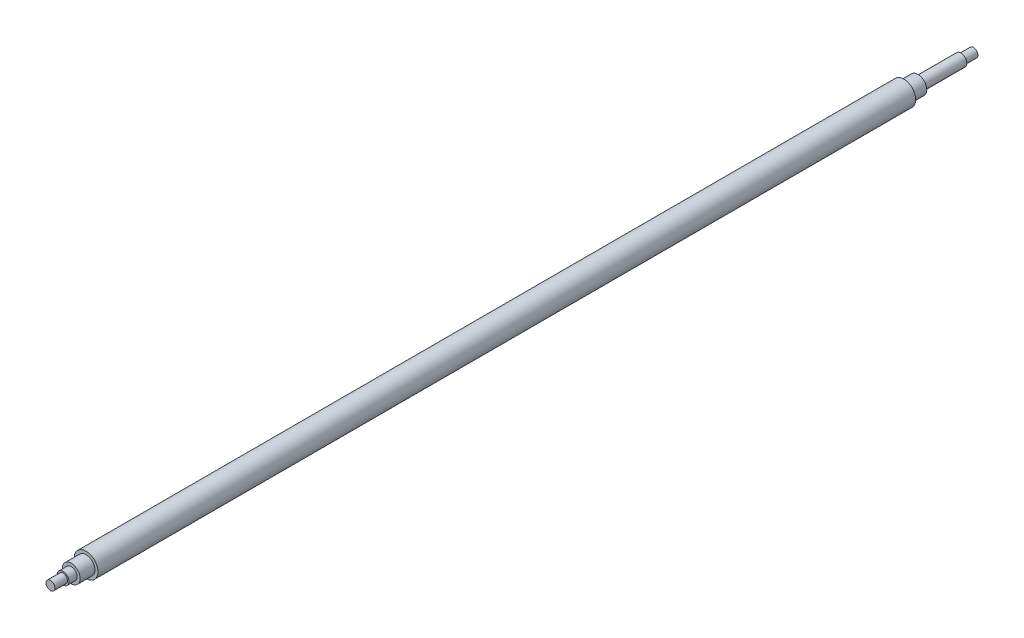
ISO-10303-21;
HEADER;
FILE_DESCRIPTION(('STEP AP214'),'2;1');
FILE_NAME('part.step','',(''),(''),'','','');
FILE_SCHEMA(('AUTOMOTIVE_DESIGN { 1 0 10303 214 1 1 1 1 }'));
ENDSEC;
DATA;
#1=APPLICATION_CONTEXT('core data for automotive mechanical design processes');
#2=APPLICATION_PROTOCOL_DEFINITION('international standard','automotive_design',2000,#1);
#3=PRODUCT_CONTEXT('',#1,'mechanical');
#4=PRODUCT('Part','Part','',(#3));
#5=PRODUCT_RELATED_PRODUCT_CATEGORY('part','',(#4));
#6=PRODUCT_DEFINITION_FORMATION('','',#4);
#7=PRODUCT_DEFINITION_CONTEXT('part definition',#1,'design');
#8=PRODUCT_DEFINITION('design','',#6,#7);
#9=PRODUCT_DEFINITION_SHAPE('','',#8);
#10=(LENGTH_UNIT() NAMED_UNIT(*) SI_UNIT(.MILLI.,.METRE.));
#11=(NAMED_UNIT(*) PLANE_ANGLE_UNIT() SI_UNIT($,.RADIAN.));
#12=(NAMED_UNIT(*) SI_UNIT($,.STERADIAN.) SOLID_ANGLE_UNIT());
#13=UNCERTAINTY_MEASURE_WITH_UNIT(LENGTH_MEASURE(1.E-05),#10,'distance_accuracy_value','');
#14=(GEOMETRIC_REPRESENTATION_CONTEXT(3) GLOBAL_UNCERTAINTY_ASSIGNED_CONTEXT((#13)) GLOBAL_UNIT_ASSIGNED_CONTEXT((#10,
#11,#12)) REPRESENTATION_CONTEXT('',''));
#15=CARTESIAN_POINT('',(0.,0.,0.));
#16=DIRECTION('',(0.,0.,1.));
#17=DIRECTION('',(1.,0.,0.));
#18=AXIS2_PLACEMENT_3D('',#15,#16,#17);
#19=CARTESIAN_POINT('',(0.,0.,-622.));
#20=DIRECTION('',(0.,0.,1.));
#21=DIRECTION('',(1.,0.,0.));
#22=AXIS2_PLACEMENT_3D('',#19,#20,#21);
#23=PLANE('',#22);
#24=CARTESIAN_POINT('',(0.,0.,-622.));
#25=DIRECTION('',(0.,0.,1.));
#26=DIRECTION('',(1.,0.,0.));
#27=AXIS2_PLACEMENT_3D('',#24,#25,#26);
#28=CIRCLE('',#27,3.);
#29=CARTESIAN_POINT('',(3.,0.,-622.));
#30=VERTEX_POINT('',#29);
#31=EDGE_CURVE('E76',#30,#30,#28,.T.);
#32=ORIENTED_EDGE('',*,*,#31,.F.);
#33=EDGE_LOOP('',(#32));
#34=FACE_BOUND('',#33,.T.);
#35=ADVANCED_FACE('F30',(#34),#23,.F.);
#36=CARTESIAN_POINT('',(0.,0.,0.));
#37=DIRECTION('',(0.,0.,-1.));
#38=DIRECTION('',(-1.,0.,0.));
#39=AXIS2_PLACEMENT_3D('',#36,#37,#38);
#40=PLANE('',#39);
#41=CARTESIAN_POINT('',(0.,0.,0.));
#42=DIRECTION('',(0.,0.,1.));
#43=DIRECTION('',(1.,0.,0.));
#44=AXIS2_PLACEMENT_3D('',#41,#42,#43);
#45=CIRCLE('',#44,3.);
#46=CARTESIAN_POINT('',(3.,0.,0.));
#47=VERTEX_POINT('',#46);
#48=EDGE_CURVE('E10',#47,#47,#45,.T.);
#49=ORIENTED_EDGE('',*,*,#48,.T.);
#50=EDGE_LOOP('',(#49));
#51=FACE_BOUND('',#50,.T.);
#52=ADVANCED_FACE('F83',(#51),#40,.F.);
#53=CARTESIAN_POINT('',(0.,0.,0.));
#54=DIRECTION('',(0.,0.,1.));
#55=DIRECTION('',(1.,0.,0.));
#56=AXIS2_PLACEMENT_3D('',#53,#54,#55);
#57=CYLINDRICAL_SURFACE('',#56,3.);
#58=ORIENTED_EDGE('',*,*,#48,.F.);
#59=EDGE_LOOP('',(#58));
#60=FACE_BOUND('',#59,.T.);
#61=CARTESIAN_POINT('',(0.,0.,-8.5));
#62=DIRECTION('',(0.,0.,1.));
#63=DIRECTION('',(1.,0.,0.));
#64=AXIS2_PLACEMENT_3D('',#61,#62,#63);
#65=CIRCLE('',#64,3.);
#66=CARTESIAN_POINT('',(3.,0.,-8.5));
#67=VERTEX_POINT('',#66);
#68=EDGE_CURVE('E36',#67,#67,#65,.T.);
#69=ORIENTED_EDGE('',*,*,#68,.T.);
#70=EDGE_LOOP('',(#69));
#71=FACE_BOUND('',#70,.T.);
#72=ADVANCED_FACE('F87',(#60,#71),#57,.T.);
#73=CARTESIAN_POINT('',(0.,3.,-8.5));
#74=DIRECTION('',(0.,0.,-1.));
#75=DIRECTION('',(-1.,0.,0.));
#76=AXIS2_PLACEMENT_3D('',#73,#74,#75);
#77=PLANE('',#76);
#78=ORIENTED_EDGE('',*,*,#68,.F.);
#79=EDGE_LOOP('',(#78));
#80=FACE_BOUND('',#79,.T.);
#81=CARTESIAN_POINT('',(0.,0.,-8.5));
#82=DIRECTION('',(0.,0.,1.));
#83=DIRECTION('',(1.,0.,0.));
#84=AXIS2_PLACEMENT_3D('',#81,#82,#83);
#85=CIRCLE('',#84,4.);
#86=CARTESIAN_POINT('',(4.,0.,-8.5));
#87=VERTEX_POINT('',#86);
#88=EDGE_CURVE('E40',#87,#87,#85,.T.);
#89=ORIENTED_EDGE('',*,*,#88,.T.);
#90=EDGE_LOOP('',(#89));
#91=FACE_BOUND('',#90,.T.);
#92=ADVANCED_FACE('F91',(#80,#91),#77,.F.);
#93=CARTESIAN_POINT('',(0.,0.,0.));
#94=DIRECTION('',(0.,0.,1.));
#95=DIRECTION('',(1.,0.,0.));
#96=AXIS2_PLACEMENT_3D('',#93,#94,#95);
#97=CYLINDRICAL_SURFACE('',#96,4.);
#98=ORIENTED_EDGE('',*,*,#88,.F.);
#99=EDGE_LOOP('',(#98));
#100=FACE_BOUND('',#99,.T.);
#101=CARTESIAN_POINT('',(0.,0.,-14.));
#102=DIRECTION('',(0.,0.,1.));
#103=DIRECTION('',(1.,0.,0.));
#104=AXIS2_PLACEMENT_3D('',#101,#102,#103);
#105=CIRCLE('',#104,4.);
#106=CARTESIAN_POINT('',(4.,0.,-14.));
#107=VERTEX_POINT('',#106);
#108=EDGE_CURVE('E44',#107,#107,#105,.T.);
#109=ORIENTED_EDGE('',*,*,#108,.T.);
#110=EDGE_LOOP('',(#109));
#111=FACE_BOUND('',#110,.T.);
#112=ADVANCED_FACE('F97',(#100,#111),#97,.T.);
#113=CARTESIAN_POINT('',(0.,4.,-14.));
#114=DIRECTION('',(0.,0.,-1.));
#115=DIRECTION('',(-1.,0.,0.));
#116=AXIS2_PLACEMENT_3D('',#113,#114,#115);
#117=PLANE('',#116);
#118=ORIENTED_EDGE('',*,*,#108,.F.);
#119=EDGE_LOOP('',(#118));
#120=FACE_BOUND('',#119,.T.);
#121=CARTESIAN_POINT('',(0.,0.,-14.));
#122=DIRECTION('',(0.,0.,1.));
#123=DIRECTION('',(1.,0.,0.));
#124=AXIS2_PLACEMENT_3D('',#121,#122,#123);
#125=CIRCLE('',#124,6.);
#126=CARTESIAN_POINT('',(6.,0.,-14.));
#127=VERTEX_POINT('',#126);
#128=EDGE_CURVE('E49',#127,#127,#125,.T.);
#129=ORIENTED_EDGE('',*,*,#128,.T.);
#130=EDGE_LOOP('',(#129));
#131=FACE_BOUND('',#130,.T.);
#132=ADVANCED_FACE('F101',(#120,#131),#117,.F.);
#133=CARTESIAN_POINT('',(0.,0.,0.));
#134=DIRECTION('',(0.,0.,1.));
#135=DIRECTION('',(1.,0.,0.));
#136=AXIS2_PLACEMENT_3D('',#133,#134,#135);
#137=CYLINDRICAL_SURFACE('',#136,6.);
#138=ORIENTED_EDGE('',*,*,#128,.F.);
#139=EDGE_LOOP('',(#138));
#140=FACE_BOUND('',#139,.T.);
#141=CARTESIAN_POINT('',(0.,0.,-24.));
#142=DIRECTION('',(0.,0.,1.));
#143=DIRECTION('',(1.,0.,0.));
#144=AXIS2_PLACEMENT_3D('',#141,#142,#143);
#145=CIRCLE('',#144,6.);
#146=CARTESIAN_POINT('',(6.,0.,-24.));
#147=VERTEX_POINT('',#146);
#148=EDGE_CURVE('E52',#147,#147,#145,.T.);
#149=ORIENTED_EDGE('',*,*,#148,.T.);
#150=EDGE_LOOP('',(#149));
#151=FACE_BOUND('',#150,.T.);
#152=ADVANCED_FACE('F105',(#140,#151),#137,.T.);
#153=CARTESIAN_POINT('',(0.,6.,-24.));
#154=DIRECTION('',(0.,0.,-1.));
#155=DIRECTION('',(-1.,0.,0.));
#156=AXIS2_PLACEMENT_3D('',#153,#154,#155);
#157=PLANE('',#156);
#158=ORIENTED_EDGE('',*,*,#148,.F.);
#159=EDGE_LOOP('',(#158));
#160=FACE_BOUND('',#159,.T.);
#161=CARTESIAN_POINT('',(0.,0.,-24.));
#162=DIRECTION('',(0.,0.,1.));
#163=DIRECTION('',(1.,0.,0.));
#164=AXIS2_PLACEMENT_3D('',#161,#162,#163);
#165=CIRCLE('',#164,8.);
#166=CARTESIAN_POINT('',(8.,0.,-24.));
#167=VERTEX_POINT('',#166);
#168=EDGE_CURVE('E55',#167,#167,#165,.T.);
#169=ORIENTED_EDGE('',*,*,#168,.T.);
#170=EDGE_LOOP('',(#169));
#171=FACE_BOUND('',#170,.T.);
#172=ADVANCED_FACE('F109',(#160,#171),#157,.F.);
#173=CARTESIAN_POINT('',(0.,0.,0.));
#174=DIRECTION('',(0.,0.,1.));
#175=DIRECTION('',(1.,0.,0.));
#176=AXIS2_PLACEMENT_3D('',#173,#174,#175);
#177=CYLINDRICAL_SURFACE('',#176,8.);
#178=ORIENTED_EDGE('',*,*,#168,.F.);
#179=EDGE_LOOP('',(#178));
#180=FACE_BOUND('',#179,.T.);
#181=CARTESIAN_POINT('',(0.,0.,-575.));
#182=DIRECTION('',(0.,0.,1.));
#183=DIRECTION('',(1.,0.,0.));
#184=AXIS2_PLACEMENT_3D('',#181,#182,#183);
#185=CIRCLE('',#184,8.);
#186=CARTESIAN_POINT('',(8.,0.,-575.));
#187=VERTEX_POINT('',#186);
#188=EDGE_CURVE('E58',#187,#187,#185,.T.);
#189=ORIENTED_EDGE('',*,*,#188,.T.);
#190=EDGE_LOOP('',(#189));
#191=FACE_BOUND('',#190,.T.);
#192=ADVANCED_FACE('F113',(#180,#191),#177,.T.);
#193=CARTESIAN_POINT('',(0.,8.,-575.));
#194=DIRECTION('',(0.,0.,1.));
#195=DIRECTION('',(1.,0.,0.));
#196=AXIS2_PLACEMENT_3D('',#193,#194,#195);
#197=PLANE('',#196);
#198=ORIENTED_EDGE('',*,*,#188,.F.);
#199=EDGE_LOOP('',(#198));
#200=FACE_BOUND('',#199,.T.);
#201=CARTESIAN_POINT('',(0.,0.,-575.));
#202=DIRECTION('',(0.,0.,1.));
#203=DIRECTION('',(1.,0.,0.));
#204=AXIS2_PLACEMENT_3D('',#201,#202,#203);
#205=CIRCLE('',#204,6.);
#206=CARTESIAN_POINT('',(6.,0.,-575.));
#207=VERTEX_POINT('',#206);
#208=EDGE_CURVE('E61',#207,#207,#205,.T.);
#209=ORIENTED_EDGE('',*,*,#208,.T.);
#210=EDGE_LOOP('',(#209));
#211=FACE_BOUND('',#210,.T.);
#212=ADVANCED_FACE('F117',(#200,#211),#197,.F.);
#213=CARTESIAN_POINT('',(0.,0.,0.));
#214=DIRECTION('',(0.,0.,1.));
#215=DIRECTION('',(1.,0.,0.));
#216=AXIS2_PLACEMENT_3D('',#213,#214,#215);
#217=CYLINDRICAL_SURFACE('',#216,6.);
#218=ORIENTED_EDGE('',*,*,#208,.F.);
#219=EDGE_LOOP('',(#218));
#220=FACE_BOUND('',#219,.T.);
#221=CARTESIAN_POINT('',(0.,0.,-584.5));
#222=DIRECTION('',(0.,0.,1.));
#223=DIRECTION('',(1.,0.,0.));
#224=AXIS2_PLACEMENT_3D('',#221,#222,#223);
#225=CIRCLE('',#224,6.);
#226=CARTESIAN_POINT('',(6.,0.,-584.5));
#227=VERTEX_POINT('',#226);
#228=EDGE_CURVE('E64',#227,#227,#225,.T.);
#229=ORIENTED_EDGE('',*,*,#228,.T.);
#230=EDGE_LOOP('',(#229));
#231=FACE_BOUND('',#230,.T.);
#232=ADVANCED_FACE('F121',(#220,#231),#217,.T.);
#233=CARTESIAN_POINT('',(0.,6.,-584.5));
#234=DIRECTION('',(0.,0.,1.));
#235=DIRECTION('',(1.,0.,0.));
#236=AXIS2_PLACEMENT_3D('',#233,#234,#235);
#237=PLANE('',#236);
#238=ORIENTED_EDGE('',*,*,#228,.F.);
#239=EDGE_LOOP('',(#238));
#240=FACE_BOUND('',#239,.T.);
#241=CARTESIAN_POINT('',(0.,0.,-584.5));
#242=DIRECTION('',(0.,0.,1.));
#243=DIRECTION('',(1.,0.,0.));
#244=AXIS2_PLACEMENT_3D('',#241,#242,#243);
#245=CIRCLE('',#244,4.);
#246=CARTESIAN_POINT('',(4.,0.,-584.5));
#247=VERTEX_POINT('',#246);
#248=EDGE_CURVE('E67',#247,#247,#245,.T.);
#249=ORIENTED_EDGE('',*,*,#248,.T.);
#250=EDGE_LOOP('',(#249));
#251=FACE_BOUND('',#250,.T.);
#252=ADVANCED_FACE('F125',(#240,#251),#237,.F.);
#253=CARTESIAN_POINT('',(0.,0.,0.));
#254=DIRECTION('',(0.,0.,1.));
#255=DIRECTION('',(1.,0.,0.));
#256=AXIS2_PLACEMENT_3D('',#253,#254,#255);
#257=CYLINDRICAL_SURFACE('',#256,4.);
#258=ORIENTED_EDGE('',*,*,#248,.F.);
#259=EDGE_LOOP('',(#258));
#260=FACE_BOUND('',#259,.T.);
#261=CARTESIAN_POINT('',(0.,0.,-613.5));
#262=DIRECTION('',(0.,0.,1.));
#263=DIRECTION('',(1.,0.,0.));
#264=AXIS2_PLACEMENT_3D('',#261,#262,#263);
#265=CIRCLE('',#264,4.);
#266=CARTESIAN_POINT('',(4.,0.,-613.5));
#267=VERTEX_POINT('',#266);
#268=EDGE_CURVE('E70',#267,#267,#265,.T.);
#269=ORIENTED_EDGE('',*,*,#268,.T.);
#270=EDGE_LOOP('',(#269));
#271=FACE_BOUND('',#270,.T.);
#272=ADVANCED_FACE('F129',(#260,#271),#257,.T.);
#273=CARTESIAN_POINT('',(0.,4.,-613.5));
#274=DIRECTION('',(0.,0.,1.));
#275=DIRECTION('',(1.,0.,0.));
#276=AXIS2_PLACEMENT_3D('',#273,#274,#275);
#277=PLANE('',#276);
#278=ORIENTED_EDGE('',*,*,#268,.F.);
#279=EDGE_LOOP('',(#278));
#280=FACE_BOUND('',#279,.T.);
#281=CARTESIAN_POINT('',(0.,0.,-613.5));
#282=DIRECTION('',(0.,0.,1.));
#283=DIRECTION('',(1.,0.,0.));
#284=AXIS2_PLACEMENT_3D('',#281,#282,#283);
#285=CIRCLE('',#284,3.);
#286=CARTESIAN_POINT('',(3.,0.,-613.5));
#287=VERTEX_POINT('',#286);
#288=EDGE_CURVE('E73',#287,#287,#285,.T.);
#289=ORIENTED_EDGE('',*,*,#288,.T.);
#290=EDGE_LOOP('',(#289));
#291=FACE_BOUND('',#290,.T.);
#292=ADVANCED_FACE('F133',(#280,#291),#277,.F.);
#293=CARTESIAN_POINT('',(0.,0.,0.));
#294=DIRECTION('',(0.,0.,1.));
#295=DIRECTION('',(1.,0.,0.));
#296=AXIS2_PLACEMENT_3D('',#293,#294,#295);
#297=CYLINDRICAL_SURFACE('',#296,3.);
#298=ORIENTED_EDGE('',*,*,#288,.F.);
#299=EDGE_LOOP('',(#298));
#300=FACE_BOUND('',#299,.T.);
#301=ORIENTED_EDGE('',*,*,#31,.T.);
#302=EDGE_LOOP('',(#301));
#303=FACE_BOUND('',#302,.T.);
#304=ADVANCED_FACE('F80',(#300,#303),#297,.T.);
#305=CLOSED_SHELL('',(#35,#52,#72,#92,#112,#132,#152,#172,#192,#212,#232,#252,#272,#292,#304));
#306=MANIFOLD_SOLID_BREP('B2',#305);
#307=ADVANCED_BREP_SHAPE_REPRESENTATION('',(#18,#306),#14);
#308=SHAPE_DEFINITION_REPRESENTATION(#9,#307);
ENDSEC;
END-ISO-10303-21;
